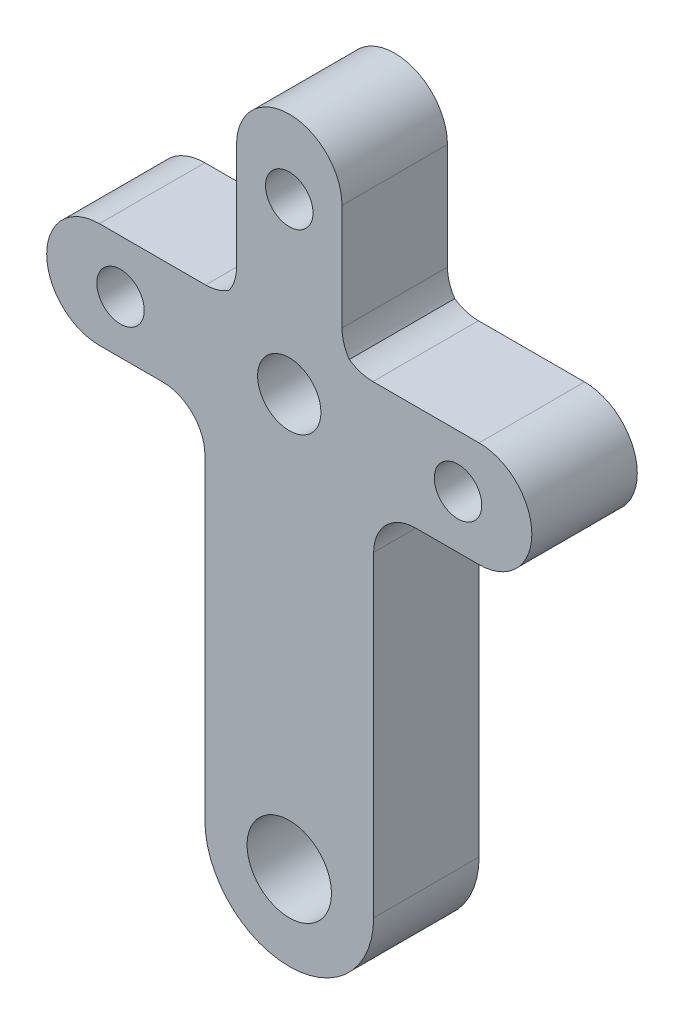
ISO-10303-21;
HEADER;
FILE_DESCRIPTION(('STEP AP214'),'2;1');
FILE_NAME('part.step','',(''),(''),'','','');
FILE_SCHEMA(('AUTOMOTIVE_DESIGN { 1 0 10303 214 1 1 1 1 }'));
ENDSEC;
DATA;
#1=APPLICATION_CONTEXT('core data for automotive mechanical design processes');
#2=APPLICATION_PROTOCOL_DEFINITION('international standard','automotive_design',2000,#1);
#3=PRODUCT_CONTEXT('',#1,'mechanical');
#4=PRODUCT('Part','Part','',(#3));
#5=PRODUCT_RELATED_PRODUCT_CATEGORY('part','',(#4));
#6=PRODUCT_DEFINITION_FORMATION('','',#4);
#7=PRODUCT_DEFINITION_CONTEXT('part definition',#1,'design');
#8=PRODUCT_DEFINITION('design','',#6,#7);
#9=PRODUCT_DEFINITION_SHAPE('','',#8);
#10=(LENGTH_UNIT() NAMED_UNIT(*) SI_UNIT(.MILLI.,.METRE.));
#11=(NAMED_UNIT(*) PLANE_ANGLE_UNIT() SI_UNIT($,.RADIAN.));
#12=(NAMED_UNIT(*) SI_UNIT($,.STERADIAN.) SOLID_ANGLE_UNIT());
#13=UNCERTAINTY_MEASURE_WITH_UNIT(LENGTH_MEASURE(1.E-05),#10,'distance_accuracy_value','');
#14=(GEOMETRIC_REPRESENTATION_CONTEXT(3) GLOBAL_UNCERTAINTY_ASSIGNED_CONTEXT((#13)) GLOBAL_UNIT_ASSIGNED_CONTEXT((#10,
#11,#12)) REPRESENTATION_CONTEXT('',''));
#15=CARTESIAN_POINT('',(0.,0.,0.));
#16=DIRECTION('',(0.,0.,1.));
#17=DIRECTION('',(1.,0.,0.));
#18=AXIS2_PLACEMENT_3D('',#15,#16,#17);
#19=CARTESIAN_POINT('',(0.,0.,5.));
#20=DIRECTION('',(0.,0.,1.));
#21=DIRECTION('',(1.,0.,0.));
#22=AXIS2_PLACEMENT_3D('',#19,#20,#21);
#23=PLANE('',#22);
#24=CARTESIAN_POINT('',(-8.,0.,5.));
#25=DIRECTION('',(0.,0.,1.));
#26=DIRECTION('',(1.,0.,0.));
#27=AXIS2_PLACEMENT_3D('',#24,#25,#26);
#28=CIRCLE('',#27,1.125);
#29=CARTESIAN_POINT('',(-6.875,0.,5.));
#30=VERTEX_POINT('',#29);
#31=EDGE_CURVE('E284',#30,#30,#28,.T.);
#32=ORIENTED_EDGE('',*,*,#31,.F.);
#33=EDGE_LOOP('',(#32));
#34=FACE_BOUND('',#33,.T.);
#35=CARTESIAN_POINT('',(-2.20880571485205E-13,7.99999999999978,5.));
#36=DIRECTION('',(0.,0.,1.));
#37=DIRECTION('',(1.,0.,0.));
#38=AXIS2_PLACEMENT_3D('',#35,#36,#37);
#39=CIRCLE('',#38,1.125);
#40=CARTESIAN_POINT('',(1.12499999999978,7.99999999999978,5.));
#41=VERTEX_POINT('',#40);
#42=EDGE_CURVE('E491',#41,#41,#39,.T.);
#43=ORIENTED_EDGE('',*,*,#42,.F.);
#44=EDGE_LOOP('',(#43));
#45=FACE_BOUND('',#44,.T.);
#46=CARTESIAN_POINT('',(8.,0.,5.));
#47=DIRECTION('',(0.,0.,1.));
#48=DIRECTION('',(1.,0.,0.));
#49=AXIS2_PLACEMENT_3D('',#46,#47,#48);
#50=CIRCLE('',#49,1.125);
#51=CARTESIAN_POINT('',(9.125,0.,5.));
#52=VERTEX_POINT('',#51);
#53=EDGE_CURVE('E475',#52,#52,#50,.T.);
#54=ORIENTED_EDGE('',*,*,#53,.F.);
#55=EDGE_LOOP('',(#54));
#56=FACE_BOUND('',#55,.T.);
#57=CARTESIAN_POINT('',(0.,-19.5,5.));
#58=DIRECTION('',(0.,0.,1.));
#59=DIRECTION('',(1.,0.,0.));
#60=AXIS2_PLACEMENT_3D('',#57,#58,#59);
#61=CIRCLE('',#60,2.);
#62=CARTESIAN_POINT('',(2.,-19.5,5.));
#63=VERTEX_POINT('',#62);
#64=EDGE_CURVE('E277',#63,#63,#61,.T.);
#65=ORIENTED_EDGE('',*,*,#64,.F.);
#66=EDGE_LOOP('',(#65));
#67=FACE_BOUND('',#66,.T.);
#68=CARTESIAN_POINT('',(0.,0.,5.));
#69=DIRECTION('',(0.,0.,1.));
#70=DIRECTION('',(1.,0.,0.));
#71=AXIS2_PLACEMENT_3D('',#68,#69,#70);
#72=CIRCLE('',#71,1.5);
#73=CARTESIAN_POINT('',(1.5,0.,5.));
#74=VERTEX_POINT('',#73);
#75=EDGE_CURVE('E227',#74,#74,#72,.T.);
#76=ORIENTED_EDGE('',*,*,#75,.F.);
#77=EDGE_LOOP('',(#76));
#78=FACE_BOUND('',#77,.T.);
#79=CARTESIAN_POINT('',(3.96862696659689,4.5,5.));
#80=DIRECTION('',(0.,0.,1.));
#81=DIRECTION('',(1.,0.,0.));
#82=AXIS2_PLACEMENT_3D('',#79,#80,#81);
#83=CIRCLE('',#82,2.);
#84=CARTESIAN_POINT('',(3.96862696659689,2.5,5.));
#85=VERTEX_POINT('',#84);
#86=CARTESIAN_POINT('',(2.84528120331248,2.84528120331248,5.));
#87=VERTEX_POINT('',#86);
#88=EDGE_CURVE('E69',#85,#87,#83,.F.);
#89=ORIENTED_EDGE('',*,*,#88,.T.);
#90=CARTESIAN_POINT('',(4.5,3.96862696659689,5.));
#91=DIRECTION('',(0.,0.,1.));
#92=DIRECTION('',(1.,0.,0.));
#93=AXIS2_PLACEMENT_3D('',#90,#91,#92);
#94=CIRCLE('',#93,2.);
#95=CARTESIAN_POINT('',(2.5,3.96862696659689,5.));
#96=VERTEX_POINT('',#95);
#97=EDGE_CURVE('E270',#87,#96,#94,.F.);
#98=ORIENTED_EDGE('',*,*,#97,.T.);
#99=DIRECTION('',(0.,1.,0.));
#100=VECTOR('',#99,1.);
#101=CARTESIAN_POINT('',(2.5,0.,5.));
#102=LINE('',#101,#100);
#103=CARTESIAN_POINT('',(2.5,9.,5.));
#104=VERTEX_POINT('',#103);
#105=EDGE_CURVE('E230',#96,#104,#102,.T.);
#106=ORIENTED_EDGE('',*,*,#105,.T.);
#107=CARTESIAN_POINT('',(0.,9.,5.));
#108=DIRECTION('',(0.,0.,1.));
#109=DIRECTION('',(1.,0.,0.));
#110=AXIS2_PLACEMENT_3D('',#107,#108,#109);
#111=CIRCLE('',#110,2.5);
#112=CARTESIAN_POINT('',(-2.5,9.,5.));
#113=VERTEX_POINT('',#112);
#114=EDGE_CURVE('E359',#104,#113,#111,.T.);
#115=ORIENTED_EDGE('',*,*,#114,.T.);
#116=DIRECTION('',(0.,1.,0.));
#117=VECTOR('',#116,1.);
#118=CARTESIAN_POINT('',(-2.5,0.,5.));
#119=LINE('',#118,#117);
#120=CARTESIAN_POINT('',(-2.5,3.96862696659689,5.));
#121=VERTEX_POINT('',#120);
#122=EDGE_CURVE('E363',#121,#113,#119,.T.);
#123=ORIENTED_EDGE('',*,*,#122,.F.);
#124=CARTESIAN_POINT('',(-4.5,3.96862696659689,5.));
#125=DIRECTION('',(0.,0.,1.));
#126=DIRECTION('',(1.,0.,0.));
#127=AXIS2_PLACEMENT_3D('',#124,#125,#126);
#128=CIRCLE('',#127,2.);
#129=CARTESIAN_POINT('',(-2.84528120331248,2.84528120331248,5.));
#130=VERTEX_POINT('',#129);
#131=EDGE_CURVE('E263',#121,#130,#128,.F.);
#132=ORIENTED_EDGE('',*,*,#131,.T.);
#133=CARTESIAN_POINT('',(-3.96862696659689,4.5,5.));
#134=DIRECTION('',(0.,0.,1.));
#135=DIRECTION('',(1.,0.,0.));
#136=AXIS2_PLACEMENT_3D('',#133,#134,#135);
#137=CIRCLE('',#136,2.);
#138=CARTESIAN_POINT('',(-3.96862696659689,2.5,5.));
#139=VERTEX_POINT('',#138);
#140=EDGE_CURVE('E259',#130,#139,#137,.F.);
#141=ORIENTED_EDGE('',*,*,#140,.T.);
#142=DIRECTION('',(-1.,0.,0.));
#143=VECTOR('',#142,1.);
#144=CARTESIAN_POINT('',(0.,2.5,5.));
#145=LINE('',#144,#143);
#146=CARTESIAN_POINT('',(-9.,2.5,5.));
#147=VERTEX_POINT('',#146);
#148=EDGE_CURVE('E181',#139,#147,#145,.T.);
#149=ORIENTED_EDGE('',*,*,#148,.T.);
#150=CARTESIAN_POINT('',(-9.,0.,5.));
#151=DIRECTION('',(0.,0.,1.));
#152=DIRECTION('',(1.,0.,0.));
#153=AXIS2_PLACEMENT_3D('',#150,#151,#152);
#154=CIRCLE('',#153,2.5);
#155=CARTESIAN_POINT('',(-9.,-2.5,5.));
#156=VERTEX_POINT('',#155);
#157=EDGE_CURVE('E190',#147,#156,#154,.T.);
#158=ORIENTED_EDGE('',*,*,#157,.T.);
#159=DIRECTION('',(-1.,0.,0.));
#160=VECTOR('',#159,1.);
#161=CARTESIAN_POINT('',(0.,-2.5,5.));
#162=LINE('',#161,#160);
#163=CARTESIAN_POINT('',(-6.,-2.5,5.));
#164=VERTEX_POINT('',#163);
#165=EDGE_CURVE('E368',#164,#156,#162,.T.);
#166=ORIENTED_EDGE('',*,*,#165,.F.);
#167=CARTESIAN_POINT('',(-6.,-4.5,5.));
#168=DIRECTION('',(0.,0.,1.));
#169=DIRECTION('',(1.,0.,0.));
#170=AXIS2_PLACEMENT_3D('',#167,#168,#169);
#171=CIRCLE('',#170,2.);
#172=CARTESIAN_POINT('',(-4.,-4.5,5.));
#173=VERTEX_POINT('',#172);
#174=EDGE_CURVE('E255',#164,#173,#171,.F.);
#175=ORIENTED_EDGE('',*,*,#174,.T.);
#176=DIRECTION('',(0.,-1.,0.));
#177=VECTOR('',#176,1.);
#178=CARTESIAN_POINT('',(-4.,0.,5.));
#179=LINE('',#178,#177);
#180=CARTESIAN_POINT('',(-4.,-19.5,5.));
#181=VERTEX_POINT('',#180);
#182=EDGE_CURVE('E207',#173,#181,#179,.T.);
#183=ORIENTED_EDGE('',*,*,#182,.T.);
#184=CARTESIAN_POINT('',(0.,-19.5,5.));
#185=DIRECTION('',(0.,0.,1.));
#186=DIRECTION('',(1.,0.,0.));
#187=AXIS2_PLACEMENT_3D('',#184,#185,#186);
#188=CIRCLE('',#187,4.);
#189=CARTESIAN_POINT('',(4.,-19.5,5.));
#190=VERTEX_POINT('',#189);
#191=EDGE_CURVE('E379',#181,#190,#188,.T.);
#192=ORIENTED_EDGE('',*,*,#191,.T.);
#193=DIRECTION('',(0.,-1.,0.));
#194=VECTOR('',#193,1.);
#195=CARTESIAN_POINT('',(4.,0.,5.));
#196=LINE('',#195,#194);
#197=CARTESIAN_POINT('',(4.,-4.5,5.));
#198=VERTEX_POINT('',#197);
#199=EDGE_CURVE('E372',#198,#190,#196,.T.);
#200=ORIENTED_EDGE('',*,*,#199,.F.);
#201=CARTESIAN_POINT('',(6.,-4.5,5.));
#202=DIRECTION('',(0.,0.,1.));
#203=DIRECTION('',(1.,0.,0.));
#204=AXIS2_PLACEMENT_3D('',#201,#202,#203);
#205=CIRCLE('',#204,2.);
#206=CARTESIAN_POINT('',(6.,-2.5,5.));
#207=VERTEX_POINT('',#206);
#208=EDGE_CURVE('E53',#198,#207,#205,.F.);
#209=ORIENTED_EDGE('',*,*,#208,.T.);
#210=DIRECTION('',(1.,0.,0.));
#211=VECTOR('',#210,1.);
#212=CARTESIAN_POINT('',(0.,-2.5,5.));
#213=LINE('',#212,#211);
#214=CARTESIAN_POINT('',(9.,-2.5,5.));
#215=VERTEX_POINT('',#214);
#216=EDGE_CURVE('E219',#207,#215,#213,.T.);
#217=ORIENTED_EDGE('',*,*,#216,.T.);
#218=CARTESIAN_POINT('',(9.,0.,5.));
#219=DIRECTION('',(0.,0.,1.));
#220=DIRECTION('',(1.,0.,0.));
#221=AXIS2_PLACEMENT_3D('',#218,#219,#220);
#222=CIRCLE('',#221,2.5);
#223=CARTESIAN_POINT('',(9.,2.5,5.));
#224=VERTEX_POINT('',#223);
#225=EDGE_CURVE('E350',#215,#224,#222,.T.);
#226=ORIENTED_EDGE('',*,*,#225,.T.);
#227=DIRECTION('',(1.,0.,0.));
#228=VECTOR('',#227,1.);
#229=CARTESIAN_POINT('',(0.,2.5,5.));
#230=LINE('',#229,#228);
#231=EDGE_CURVE('E346',#85,#224,#230,.T.);
#232=ORIENTED_EDGE('',*,*,#231,.F.);
#233=EDGE_LOOP('',(#89,#98,#106,#115,#123,#132,#141,#149,#158,#166,#175,#183,#192,#200,#209,
#217,#226,#232));
#234=FACE_BOUND('',#233,.T.);
#235=ADVANCED_FACE('F44',(#34,#45,#56,#67,#78,#234),#23,.T.);
#236=CARTESIAN_POINT('',(0.,0.,0.));
#237=DIRECTION('',(0.,0.,1.));
#238=DIRECTION('',(1.,0.,0.));
#239=AXIS2_PLACEMENT_3D('',#236,#237,#238);
#240=PLANE('',#239);
#241=CARTESIAN_POINT('',(-8.,0.,0.));
#242=DIRECTION('',(0.,0.,1.));
#243=DIRECTION('',(1.,0.,0.));
#244=AXIS2_PLACEMENT_3D('',#241,#242,#243);
#245=CIRCLE('',#244,1.125);
#246=CARTESIAN_POINT('',(-6.875,0.,0.));
#247=VERTEX_POINT('',#246);
#248=EDGE_CURVE('E48',#247,#247,#245,.T.);
#249=ORIENTED_EDGE('',*,*,#248,.T.);
#250=EDGE_LOOP('',(#249));
#251=FACE_BOUND('',#250,.T.);
#252=CARTESIAN_POINT('',(-2.20880571485205E-13,7.99999999999978,0.));
#253=DIRECTION('',(0.,0.,1.));
#254=DIRECTION('',(1.,0.,0.));
#255=AXIS2_PLACEMENT_3D('',#252,#253,#254);
#256=CIRCLE('',#255,1.125);
#257=CARTESIAN_POINT('',(1.12499999999978,7.99999999999978,0.));
#258=VERTEX_POINT('',#257);
#259=EDGE_CURVE('E283',#258,#258,#256,.T.);
#260=ORIENTED_EDGE('',*,*,#259,.T.);
#261=EDGE_LOOP('',(#260));
#262=FACE_BOUND('',#261,.T.);
#263=CARTESIAN_POINT('',(8.,0.,0.));
#264=DIRECTION('',(0.,0.,1.));
#265=DIRECTION('',(1.,0.,0.));
#266=AXIS2_PLACEMENT_3D('',#263,#264,#265);
#267=CIRCLE('',#266,1.125);
#268=CARTESIAN_POINT('',(9.125,0.,0.));
#269=VERTEX_POINT('',#268);
#270=EDGE_CURVE('E281',#269,#269,#267,.T.);
#271=ORIENTED_EDGE('',*,*,#270,.T.);
#272=EDGE_LOOP('',(#271));
#273=FACE_BOUND('',#272,.T.);
#274=CARTESIAN_POINT('',(0.,-19.5,0.));
#275=DIRECTION('',(0.,0.,1.));
#276=DIRECTION('',(1.,0.,0.));
#277=AXIS2_PLACEMENT_3D('',#274,#275,#276);
#278=CIRCLE('',#277,2.);
#279=CARTESIAN_POINT('',(2.,-19.5,0.));
#280=VERTEX_POINT('',#279);
#281=EDGE_CURVE('E361',#280,#280,#278,.F.);
#282=ORIENTED_EDGE('',*,*,#281,.F.);
#283=EDGE_LOOP('',(#282));
#284=FACE_BOUND('',#283,.T.);
#285=CARTESIAN_POINT('',(0.,0.,0.));
#286=DIRECTION('',(0.,0.,1.));
#287=DIRECTION('',(1.,0.,0.));
#288=AXIS2_PLACEMENT_3D('',#285,#286,#287);
#289=CIRCLE('',#288,1.5);
#290=CARTESIAN_POINT('',(1.5,0.,0.));
#291=VERTEX_POINT('',#290);
#292=EDGE_CURVE('E234',#291,#291,#289,.F.);
#293=ORIENTED_EDGE('',*,*,#292,.F.);
#294=EDGE_LOOP('',(#293));
#295=FACE_BOUND('',#294,.T.);
#296=CARTESIAN_POINT('',(0.,9.,0.));
#297=DIRECTION('',(0.,0.,1.));
#298=DIRECTION('',(1.,0.,0.));
#299=AXIS2_PLACEMENT_3D('',#296,#297,#298);
#300=CIRCLE('',#299,2.5);
#301=CARTESIAN_POINT('',(-2.5,9.,0.));
#302=VERTEX_POINT('',#301);
#303=CARTESIAN_POINT('',(2.5,9.,0.));
#304=VERTEX_POINT('',#303);
#305=EDGE_CURVE('E360',#302,#304,#300,.F.);
#306=ORIENTED_EDGE('',*,*,#305,.T.);
#307=DIRECTION('',(0.,-1.,0.));
#308=VECTOR('',#307,1.);
#309=CARTESIAN_POINT('',(2.5,0.,0.));
#310=LINE('',#309,#308);
#311=CARTESIAN_POINT('',(2.5,3.96862696659689,0.));
#312=VERTEX_POINT('',#311);
#313=EDGE_CURVE('E228',#304,#312,#310,.T.);
#314=ORIENTED_EDGE('',*,*,#313,.T.);
#315=CARTESIAN_POINT('',(4.5,3.96862696659689,0.));
#316=DIRECTION('',(0.,0.,1.));
#317=DIRECTION('',(1.,0.,0.));
#318=AXIS2_PLACEMENT_3D('',#315,#316,#317);
#319=CIRCLE('',#318,2.);
#320=CARTESIAN_POINT('',(2.84528120331248,2.84528120331248,0.));
#321=VERTEX_POINT('',#320);
#322=EDGE_CURVE('E61',#312,#321,#319,.T.);
#323=ORIENTED_EDGE('',*,*,#322,.T.);
#324=CARTESIAN_POINT('',(3.96862696659689,4.5,0.));
#325=DIRECTION('',(0.,0.,1.));
#326=DIRECTION('',(1.,0.,0.));
#327=AXIS2_PLACEMENT_3D('',#324,#325,#326);
#328=CIRCLE('',#327,2.);
#329=CARTESIAN_POINT('',(3.96862696659689,2.5,0.));
#330=VERTEX_POINT('',#329);
#331=EDGE_CURVE('E268',#321,#330,#328,.T.);
#332=ORIENTED_EDGE('',*,*,#331,.T.);
#333=DIRECTION('',(-1.,0.,0.));
#334=VECTOR('',#333,1.);
#335=CARTESIAN_POINT('',(0.,2.5,0.));
#336=LINE('',#335,#334);
#337=CARTESIAN_POINT('',(9.,2.5,0.));
#338=VERTEX_POINT('',#337);
#339=EDGE_CURVE('E215',#338,#330,#336,.T.);
#340=ORIENTED_EDGE('',*,*,#339,.F.);
#341=CARTESIAN_POINT('',(9.,0.,0.));
#342=DIRECTION('',(0.,0.,1.));
#343=DIRECTION('',(1.,0.,0.));
#344=AXIS2_PLACEMENT_3D('',#341,#342,#343);
#345=CIRCLE('',#344,2.5);
#346=CARTESIAN_POINT('',(9.,-2.5,0.));
#347=VERTEX_POINT('',#346);
#348=EDGE_CURVE('E221',#338,#347,#345,.F.);
#349=ORIENTED_EDGE('',*,*,#348,.T.);
#350=DIRECTION('',(-1.,0.,0.));
#351=VECTOR('',#350,1.);
#352=CARTESIAN_POINT('',(0.,-2.5,0.));
#353=LINE('',#352,#351);
#354=CARTESIAN_POINT('',(6.,-2.5,0.));
#355=VERTEX_POINT('',#354);
#356=EDGE_CURVE('E216',#347,#355,#353,.T.);
#357=ORIENTED_EDGE('',*,*,#356,.T.);
#358=CARTESIAN_POINT('',(6.,-4.5,0.));
#359=DIRECTION('',(0.,0.,1.));
#360=DIRECTION('',(1.,0.,0.));
#361=AXIS2_PLACEMENT_3D('',#358,#359,#360);
#362=CIRCLE('',#361,2.);
#363=CARTESIAN_POINT('',(4.,-4.5,0.));
#364=VERTEX_POINT('',#363);
#365=EDGE_CURVE('E12',#355,#364,#362,.T.);
#366=ORIENTED_EDGE('',*,*,#365,.T.);
#367=DIRECTION('',(0.,1.,0.));
#368=VECTOR('',#367,1.);
#369=CARTESIAN_POINT('',(4.,0.,0.));
#370=LINE('',#369,#368);
#371=CARTESIAN_POINT('',(4.,-19.5,0.));
#372=VERTEX_POINT('',#371);
#373=EDGE_CURVE('E202',#372,#364,#370,.T.);
#374=ORIENTED_EDGE('',*,*,#373,.F.);
#375=CARTESIAN_POINT('',(0.,-19.5,0.));
#376=DIRECTION('',(0.,0.,1.));
#377=DIRECTION('',(1.,0.,0.));
#378=AXIS2_PLACEMENT_3D('',#375,#376,#377);
#379=CIRCLE('',#378,4.);
#380=CARTESIAN_POINT('',(-4.,-19.5,0.));
#381=VERTEX_POINT('',#380);
#382=EDGE_CURVE('E209',#372,#381,#379,.F.);
#383=ORIENTED_EDGE('',*,*,#382,.T.);
#384=DIRECTION('',(0.,1.,0.));
#385=VECTOR('',#384,1.);
#386=CARTESIAN_POINT('',(-4.,0.,0.));
#387=LINE('',#386,#385);
#388=CARTESIAN_POINT('',(-4.,-4.5,0.));
#389=VERTEX_POINT('',#388);
#390=EDGE_CURVE('E204',#381,#389,#387,.T.);
#391=ORIENTED_EDGE('',*,*,#390,.T.);
#392=CARTESIAN_POINT('',(-6.,-4.5,0.));
#393=DIRECTION('',(0.,0.,1.));
#394=DIRECTION('',(1.,0.,0.));
#395=AXIS2_PLACEMENT_3D('',#392,#393,#394);
#396=CIRCLE('',#395,2.);
#397=CARTESIAN_POINT('',(-6.,-2.5,0.));
#398=VERTEX_POINT('',#397);
#399=EDGE_CURVE('E257',#389,#398,#396,.T.);
#400=ORIENTED_EDGE('',*,*,#399,.T.);
#401=DIRECTION('',(1.,0.,0.));
#402=VECTOR('',#401,1.);
#403=CARTESIAN_POINT('',(0.,-2.5,0.));
#404=LINE('',#403,#402);
#405=CARTESIAN_POINT('',(-9.,-2.5,0.));
#406=VERTEX_POINT('',#405);
#407=EDGE_CURVE('E196',#406,#398,#404,.T.);
#408=ORIENTED_EDGE('',*,*,#407,.F.);
#409=CARTESIAN_POINT('',(-9.,0.,0.));
#410=DIRECTION('',(0.,0.,1.));
#411=DIRECTION('',(1.,0.,0.));
#412=AXIS2_PLACEMENT_3D('',#409,#410,#411);
#413=CIRCLE('',#412,2.5);
#414=CARTESIAN_POINT('',(-9.,2.5,0.));
#415=VERTEX_POINT('',#414);
#416=EDGE_CURVE('E187',#406,#415,#413,.F.);
#417=ORIENTED_EDGE('',*,*,#416,.T.);
#418=DIRECTION('',(1.,0.,0.));
#419=VECTOR('',#418,1.);
#420=CARTESIAN_POINT('',(0.,2.5,0.));
#421=LINE('',#420,#419);
#422=CARTESIAN_POINT('',(-3.96862696659689,2.5,0.));
#423=VERTEX_POINT('',#422);
#424=EDGE_CURVE('E172',#415,#423,#421,.T.);
#425=ORIENTED_EDGE('',*,*,#424,.T.);
#426=CARTESIAN_POINT('',(-3.96862696659689,4.5,0.));
#427=DIRECTION('',(0.,0.,1.));
#428=DIRECTION('',(1.,0.,0.));
#429=AXIS2_PLACEMENT_3D('',#426,#427,#428);
#430=CIRCLE('',#429,2.);
#431=CARTESIAN_POINT('',(-2.84528120331248,2.84528120331248,0.));
#432=VERTEX_POINT('',#431);
#433=EDGE_CURVE('E261',#423,#432,#430,.T.);
#434=ORIENTED_EDGE('',*,*,#433,.T.);
#435=CARTESIAN_POINT('',(-4.5,3.96862696659689,0.));
#436=DIRECTION('',(0.,0.,1.));
#437=DIRECTION('',(1.,0.,0.));
#438=AXIS2_PLACEMENT_3D('',#435,#436,#437);
#439=CIRCLE('',#438,2.);
#440=CARTESIAN_POINT('',(-2.5,3.96862696659689,0.));
#441=VERTEX_POINT('',#440);
#442=EDGE_CURVE('E265',#432,#441,#439,.T.);
#443=ORIENTED_EDGE('',*,*,#442,.T.);
#444=DIRECTION('',(0.,-1.,0.));
#445=VECTOR('',#444,1.);
#446=CARTESIAN_POINT('',(-2.5,0.,0.));
#447=LINE('',#446,#445);
#448=EDGE_CURVE('E203',#302,#441,#447,.T.);
#449=ORIENTED_EDGE('',*,*,#448,.F.);
#450=EDGE_LOOP('',(#306,#314,#323,#332,#340,#349,#357,#366,#374,#383,#391,#400,#408,#417,#425,
#434,#443,#449));
#451=FACE_BOUND('',#450,.T.);
#452=ADVANCED_FACE('F194',(#251,#262,#273,#284,#295,#451),#240,.F.);
#453=CARTESIAN_POINT('',(0.,0.,-4.24264068711928));
#454=DIRECTION('',(0.,0.,1.));
#455=DIRECTION('',(1.,0.,0.));
#456=AXIS2_PLACEMENT_3D('',#453,#454,#455);
#457=CYLINDRICAL_SURFACE('',#456,1.5);
#458=ORIENTED_EDGE('',*,*,#292,.T.);
#459=EDGE_LOOP('',(#458));
#460=FACE_BOUND('',#459,.T.);
#461=ORIENTED_EDGE('',*,*,#75,.T.);
#462=EDGE_LOOP('',(#461));
#463=FACE_BOUND('',#462,.T.);
#464=ADVANCED_FACE('F310',(#460,#463),#457,.F.);
#465=CARTESIAN_POINT('',(0.,9.,-74.2462120245875));
#466=DIRECTION('',(0.,0.,1.));
#467=DIRECTION('',(1.,0.,0.));
#468=AXIS2_PLACEMENT_3D('',#465,#466,#467);
#469=CYLINDRICAL_SURFACE('',#468,2.5);
#470=DIRECTION('',(0.,0.,1.));
#471=VECTOR('',#470,1.);
#472=CARTESIAN_POINT('',(-2.5,9.,-74.2462120245875));
#473=LINE('',#472,#471);
#474=EDGE_CURVE('E182',#302,#113,#473,.T.);
#475=ORIENTED_EDGE('',*,*,#474,.T.);
#476=ORIENTED_EDGE('',*,*,#114,.F.);
#477=DIRECTION('',(0.,0.,1.));
#478=VECTOR('',#477,1.);
#479=CARTESIAN_POINT('',(2.5,9.,-74.2462120245875));
#480=LINE('',#479,#478);
#481=EDGE_CURVE('E356',#304,#104,#480,.T.);
#482=ORIENTED_EDGE('',*,*,#481,.F.);
#483=ORIENTED_EDGE('',*,*,#305,.F.);
#484=EDGE_LOOP('',(#475,#476,#482,#483));
#485=FACE_BOUND('',#484,.T.);
#486=ADVANCED_FACE('F444',(#485),#469,.T.);
#487=CARTESIAN_POINT('',(-2.5,0.,-74.2462120245875));
#488=DIRECTION('',(1.,0.,0.));
#489=DIRECTION('',(0.,1.,0.));
#490=AXIS2_PLACEMENT_3D('',#487,#488,#489);
#491=PLANE('',#490);
#492=ORIENTED_EDGE('',*,*,#448,.T.);
#493=DIRECTION('',(0.,0.,1.));
#494=VECTOR('',#493,1.);
#495=CARTESIAN_POINT('',(-2.5,3.96862696659689,-74.2462120245875));
#496=LINE('',#495,#494);
#497=EDGE_CURVE('E243',#441,#121,#496,.T.);
#498=ORIENTED_EDGE('',*,*,#497,.T.);
#499=ORIENTED_EDGE('',*,*,#122,.T.);
#500=ORIENTED_EDGE('',*,*,#474,.F.);
#501=EDGE_LOOP('',(#492,#498,#499,#500));
#502=FACE_BOUND('',#501,.T.);
#503=ADVANCED_FACE('F442',(#502),#491,.F.);
#504=CARTESIAN_POINT('',(0.,2.5,-74.2462120245875));
#505=DIRECTION('',(0.,1.,0.));
#506=DIRECTION('',(-1.,0.,0.));
#507=AXIS2_PLACEMENT_3D('',#504,#505,#506);
#508=PLANE('',#507);
#509=ORIENTED_EDGE('',*,*,#148,.F.);
#510=DIRECTION('',(0.,0.,-1.));
#511=VECTOR('',#510,1.);
#512=CARTESIAN_POINT('',(-3.96862696659689,2.5,0.));
#513=LINE('',#512,#511);
#514=EDGE_CURVE('E179',#139,#423,#513,.T.);
#515=ORIENTED_EDGE('',*,*,#514,.T.);
#516=ORIENTED_EDGE('',*,*,#424,.F.);
#517=DIRECTION('',(0.,0.,1.));
#518=VECTOR('',#517,1.);
#519=CARTESIAN_POINT('',(-9.,2.5,-74.2462120245875));
#520=LINE('',#519,#518);
#521=EDGE_CURVE('E176',#415,#147,#520,.T.);
#522=ORIENTED_EDGE('',*,*,#521,.T.);
#523=EDGE_LOOP('',(#509,#515,#516,#522));
#524=FACE_BOUND('',#523,.T.);
#525=ADVANCED_FACE('F175',(#524),#508,.T.);
#526=CARTESIAN_POINT('',(-9.,0.,-74.2462120245875));
#527=DIRECTION('',(0.,0.,1.));
#528=DIRECTION('',(1.,0.,0.));
#529=AXIS2_PLACEMENT_3D('',#526,#527,#528);
#530=CYLINDRICAL_SURFACE('',#529,2.5);
#531=DIRECTION('',(0.,0.,1.));
#532=VECTOR('',#531,1.);
#533=CARTESIAN_POINT('',(-9.,-2.5,-74.2462120245875));
#534=LINE('',#533,#532);
#535=EDGE_CURVE('E208',#406,#156,#534,.T.);
#536=ORIENTED_EDGE('',*,*,#535,.T.);
#537=ORIENTED_EDGE('',*,*,#157,.F.);
#538=ORIENTED_EDGE('',*,*,#521,.F.);
#539=ORIENTED_EDGE('',*,*,#416,.F.);
#540=EDGE_LOOP('',(#536,#537,#538,#539));
#541=FACE_BOUND('',#540,.T.);
#542=ADVANCED_FACE('F186',(#541),#530,.T.);
#543=CARTESIAN_POINT('',(0.,-2.5,-74.2462120245875));
#544=DIRECTION('',(0.,1.,0.));
#545=DIRECTION('',(-1.,0.,0.));
#546=AXIS2_PLACEMENT_3D('',#543,#544,#545);
#547=PLANE('',#546);
#548=ORIENTED_EDGE('',*,*,#407,.T.);
#549=DIRECTION('',(0.,0.,1.));
#550=VECTOR('',#549,1.);
#551=CARTESIAN_POINT('',(-6.,-2.5,-74.2462120245875));
#552=LINE('',#551,#550);
#553=EDGE_CURVE('E237',#398,#164,#552,.T.);
#554=ORIENTED_EDGE('',*,*,#553,.T.);
#555=ORIENTED_EDGE('',*,*,#165,.T.);
#556=ORIENTED_EDGE('',*,*,#535,.F.);
#557=EDGE_LOOP('',(#548,#554,#555,#556));
#558=FACE_BOUND('',#557,.T.);
#559=ADVANCED_FACE('F434',(#558),#547,.F.);
#560=CARTESIAN_POINT('',(-4.,0.,-74.2462120245875));
#561=DIRECTION('',(-1.,0.,0.));
#562=DIRECTION('',(0.,-1.,0.));
#563=AXIS2_PLACEMENT_3D('',#560,#561,#562);
#564=PLANE('',#563);
#565=ORIENTED_EDGE('',*,*,#182,.F.);
#566=DIRECTION('',(0.,0.,1.));
#567=VECTOR('',#566,1.);
#568=CARTESIAN_POINT('',(-4.,-4.5,-74.2462120245875));
#569=LINE('',#568,#567);
#570=EDGE_CURVE('E240',#173,#389,#569,.F.);
#571=ORIENTED_EDGE('',*,*,#570,.T.);
#572=ORIENTED_EDGE('',*,*,#390,.F.);
#573=DIRECTION('',(0.,0.,1.));
#574=VECTOR('',#573,1.);
#575=CARTESIAN_POINT('',(-4.,-19.5,-74.2462120245875));
#576=LINE('',#575,#574);
#577=EDGE_CURVE('E212',#381,#181,#576,.T.);
#578=ORIENTED_EDGE('',*,*,#577,.T.);
#579=EDGE_LOOP('',(#565,#571,#572,#578));
#580=FACE_BOUND('',#579,.T.);
#581=ADVANCED_FACE('F404',(#580),#564,.T.);
#582=CARTESIAN_POINT('',(0.,-19.5,-74.2462120245875));
#583=DIRECTION('',(0.,0.,1.));
#584=DIRECTION('',(1.,0.,0.));
#585=AXIS2_PLACEMENT_3D('',#582,#583,#584);
#586=CYLINDRICAL_SURFACE('',#585,4.);
#587=DIRECTION('',(0.,0.,1.));
#588=VECTOR('',#587,1.);
#589=CARTESIAN_POINT('',(4.,-19.5,-74.2462120245875));
#590=LINE('',#589,#588);
#591=EDGE_CURVE('E220',#372,#190,#590,.T.);
#592=ORIENTED_EDGE('',*,*,#591,.T.);
#593=ORIENTED_EDGE('',*,*,#191,.F.);
#594=ORIENTED_EDGE('',*,*,#577,.F.);
#595=ORIENTED_EDGE('',*,*,#382,.F.);
#596=EDGE_LOOP('',(#592,#593,#594,#595));
#597=FACE_BOUND('',#596,.T.);
#598=ADVANCED_FACE('F395',(#597),#586,.T.);
#599=CARTESIAN_POINT('',(4.,0.,-74.2462120245875));
#600=DIRECTION('',(-1.,0.,0.));
#601=DIRECTION('',(0.,-1.,0.));
#602=AXIS2_PLACEMENT_3D('',#599,#600,#601);
#603=PLANE('',#602);
#604=ORIENTED_EDGE('',*,*,#373,.T.);
#605=DIRECTION('',(0.,0.,1.));
#606=VECTOR('',#605,1.);
#607=CARTESIAN_POINT('',(4.,-4.5,-74.2462120245875));
#608=LINE('',#607,#606);
#609=EDGE_CURVE('E250',#364,#198,#608,.T.);
#610=ORIENTED_EDGE('',*,*,#609,.T.);
#611=ORIENTED_EDGE('',*,*,#199,.T.);
#612=ORIENTED_EDGE('',*,*,#591,.F.);
#613=EDGE_LOOP('',(#604,#610,#611,#612));
#614=FACE_BOUND('',#613,.T.);
#615=ADVANCED_FACE('F408',(#614),#603,.F.);
#616=CARTESIAN_POINT('',(0.,-2.5,-74.2462120245875));
#617=DIRECTION('',(0.,-1.,0.));
#618=DIRECTION('',(0.,0.,-1.));
#619=AXIS2_PLACEMENT_3D('',#616,#617,#618);
#620=PLANE('',#619);
#621=ORIENTED_EDGE('',*,*,#216,.F.);
#622=DIRECTION('',(0.,0.,1.));
#623=VECTOR('',#622,1.);
#624=CARTESIAN_POINT('',(6.,-2.5,-74.2462120245875));
#625=LINE('',#624,#623);
#626=EDGE_CURVE('E253',#207,#355,#625,.F.);
#627=ORIENTED_EDGE('',*,*,#626,.T.);
#628=ORIENTED_EDGE('',*,*,#356,.F.);
#629=DIRECTION('',(0.,0.,1.));
#630=VECTOR('',#629,1.);
#631=CARTESIAN_POINT('',(9.,-2.5,-74.2462120245875));
#632=LINE('',#631,#630);
#633=EDGE_CURVE('E224',#347,#215,#632,.T.);
#634=ORIENTED_EDGE('',*,*,#633,.T.);
#635=EDGE_LOOP('',(#621,#627,#628,#634));
#636=FACE_BOUND('',#635,.T.);
#637=ADVANCED_FACE('F414',(#636),#620,.T.);
#638=CARTESIAN_POINT('',(9.,0.,-74.2462120245875));
#639=DIRECTION('',(0.,0.,1.));
#640=DIRECTION('',(1.,0.,0.));
#641=AXIS2_PLACEMENT_3D('',#638,#639,#640);
#642=CYLINDRICAL_SURFACE('',#641,2.5);
#643=DIRECTION('',(0.,0.,1.));
#644=VECTOR('',#643,1.);
#645=CARTESIAN_POINT('',(9.,2.5,-74.2462120245875));
#646=LINE('',#645,#644);
#647=EDGE_CURVE('E231',#338,#224,#646,.T.);
#648=ORIENTED_EDGE('',*,*,#647,.T.);
#649=ORIENTED_EDGE('',*,*,#225,.F.);
#650=ORIENTED_EDGE('',*,*,#633,.F.);
#651=ORIENTED_EDGE('',*,*,#348,.F.);
#652=EDGE_LOOP('',(#648,#649,#650,#651));
#653=FACE_BOUND('',#652,.T.);
#654=ADVANCED_FACE('F416',(#653),#642,.T.);
#655=CARTESIAN_POINT('',(0.,2.5,-74.2462120245875));
#656=DIRECTION('',(0.,-1.,0.));
#657=DIRECTION('',(0.,0.,-1.));
#658=AXIS2_PLACEMENT_3D('',#655,#656,#657);
#659=PLANE('',#658);
#660=ORIENTED_EDGE('',*,*,#339,.T.);
#661=DIRECTION('',(0.,0.,1.));
#662=VECTOR('',#661,1.);
#663=CARTESIAN_POINT('',(3.96862696659689,2.5,-74.2462120245875));
#664=LINE('',#663,#662);
#665=EDGE_CURVE('E245',#330,#85,#664,.T.);
#666=ORIENTED_EDGE('',*,*,#665,.T.);
#667=ORIENTED_EDGE('',*,*,#231,.T.);
#668=ORIENTED_EDGE('',*,*,#647,.F.);
#669=EDGE_LOOP('',(#660,#666,#667,#668));
#670=FACE_BOUND('',#669,.T.);
#671=ADVANCED_FACE('F344',(#670),#659,.F.);
#672=CARTESIAN_POINT('',(2.5,0.,-74.2462120245875));
#673=DIRECTION('',(1.,0.,0.));
#674=DIRECTION('',(0.,1.,0.));
#675=AXIS2_PLACEMENT_3D('',#672,#673,#674);
#676=PLANE('',#675);
#677=ORIENTED_EDGE('',*,*,#105,.F.);
#678=DIRECTION('',(0.,0.,-1.));
#679=VECTOR('',#678,1.);
#680=CARTESIAN_POINT('',(2.5,3.96862696659689,0.));
#681=LINE('',#680,#679);
#682=EDGE_CURVE('E248',#96,#312,#681,.T.);
#683=ORIENTED_EDGE('',*,*,#682,.T.);
#684=ORIENTED_EDGE('',*,*,#313,.F.);
#685=ORIENTED_EDGE('',*,*,#481,.T.);
#686=EDGE_LOOP('',(#677,#683,#684,#685));
#687=FACE_BOUND('',#686,.T.);
#688=ADVANCED_FACE('F423',(#687),#676,.T.);
#689=CARTESIAN_POINT('',(0.,-19.5,-74.2462120245875));
#690=DIRECTION('',(0.,0.,1.));
#691=DIRECTION('',(1.,0.,0.));
#692=AXIS2_PLACEMENT_3D('',#689,#690,#691);
#693=CYLINDRICAL_SURFACE('',#692,2.);
#694=ORIENTED_EDGE('',*,*,#281,.T.);
#695=EDGE_LOOP('',(#694));
#696=FACE_BOUND('',#695,.T.);
#697=ORIENTED_EDGE('',*,*,#64,.T.);
#698=EDGE_LOOP('',(#697));
#699=FACE_BOUND('',#698,.T.);
#700=ADVANCED_FACE('F321',(#696,#699),#693,.F.);
#701=CARTESIAN_POINT('',(-6.,-4.5,-74.2462120245875));
#702=DIRECTION('',(0.,0.,1.));
#703=DIRECTION('',(1.,0.,0.));
#704=AXIS2_PLACEMENT_3D('',#701,#702,#703);
#705=CYLINDRICAL_SURFACE('',#704,2.);
#706=ORIENTED_EDGE('',*,*,#399,.F.);
#707=ORIENTED_EDGE('',*,*,#570,.F.);
#708=ORIENTED_EDGE('',*,*,#174,.F.);
#709=ORIENTED_EDGE('',*,*,#553,.F.);
#710=EDGE_LOOP('',(#706,#707,#708,#709));
#711=FACE_BOUND('',#710,.T.);
#712=ADVANCED_FACE('F317',(#711),#705,.F.);
#713=CARTESIAN_POINT('',(-4.5,3.96862696659689,-74.2462120245875));
#714=DIRECTION('',(0.,0.,1.));
#715=DIRECTION('',(1.,0.,0.));
#716=AXIS2_PLACEMENT_3D('',#713,#714,#715);
#717=CYLINDRICAL_SURFACE('',#716,2.);
#718=ORIENTED_EDGE('',*,*,#497,.F.);
#719=ORIENTED_EDGE('',*,*,#442,.F.);
#720=DIRECTION('',(0.,0.,1.));
#721=VECTOR('',#720,1.);
#722=CARTESIAN_POINT('',(-2.84528120331248,2.84528120331248,2.5));
#723=LINE('',#722,#721);
#724=EDGE_CURVE('E274',#130,#432,#723,.F.);
#725=ORIENTED_EDGE('',*,*,#724,.F.);
#726=ORIENTED_EDGE('',*,*,#131,.F.);
#727=EDGE_LOOP('',(#718,#719,#725,#726));
#728=FACE_BOUND('',#727,.T.);
#729=ADVANCED_FACE('F320',(#728),#717,.F.);
#730=CARTESIAN_POINT('',(-3.96862696659689,4.5,-74.2462120245875));
#731=DIRECTION('',(0.,0.,1.));
#732=DIRECTION('',(1.,0.,0.));
#733=AXIS2_PLACEMENT_3D('',#730,#731,#732);
#734=CYLINDRICAL_SURFACE('',#733,2.);
#735=ORIENTED_EDGE('',*,*,#433,.F.);
#736=ORIENTED_EDGE('',*,*,#514,.F.);
#737=ORIENTED_EDGE('',*,*,#140,.F.);
#738=ORIENTED_EDGE('',*,*,#724,.T.);
#739=EDGE_LOOP('',(#735,#736,#737,#738));
#740=FACE_BOUND('',#739,.T.);
#741=ADVANCED_FACE('F323',(#740),#734,.F.);
#742=CARTESIAN_POINT('',(4.5,3.96862696659689,-74.2462120245875));
#743=DIRECTION('',(0.,0.,1.));
#744=DIRECTION('',(1.,0.,0.));
#745=AXIS2_PLACEMENT_3D('',#742,#743,#744);
#746=CYLINDRICAL_SURFACE('',#745,2.);
#747=DIRECTION('',(0.,0.,1.));
#748=VECTOR('',#747,1.);
#749=CARTESIAN_POINT('',(2.84528120331248,2.84528120331248,2.5));
#750=LINE('',#749,#748);
#751=EDGE_CURVE('E278',#321,#87,#750,.T.);
#752=ORIENTED_EDGE('',*,*,#751,.F.);
#753=ORIENTED_EDGE('',*,*,#322,.F.);
#754=ORIENTED_EDGE('',*,*,#682,.F.);
#755=ORIENTED_EDGE('',*,*,#97,.F.);
#756=EDGE_LOOP('',(#752,#753,#754,#755));
#757=FACE_BOUND('',#756,.T.);
#758=ADVANCED_FACE('F326',(#757),#746,.F.);
#759=CARTESIAN_POINT('',(3.96862696659689,4.5,-74.2462120245875));
#760=DIRECTION('',(0.,0.,1.));
#761=DIRECTION('',(1.,0.,0.));
#762=AXIS2_PLACEMENT_3D('',#759,#760,#761);
#763=CYLINDRICAL_SURFACE('',#762,2.);
#764=ORIENTED_EDGE('',*,*,#331,.F.);
#765=ORIENTED_EDGE('',*,*,#751,.T.);
#766=ORIENTED_EDGE('',*,*,#88,.F.);
#767=ORIENTED_EDGE('',*,*,#665,.F.);
#768=EDGE_LOOP('',(#764,#765,#766,#767));
#769=FACE_BOUND('',#768,.T.);
#770=ADVANCED_FACE('F331',(#769),#763,.F.);
#771=CARTESIAN_POINT('',(6.,-4.5,-74.2462120245875));
#772=DIRECTION('',(0.,0.,1.));
#773=DIRECTION('',(1.,0.,0.));
#774=AXIS2_PLACEMENT_3D('',#771,#772,#773);
#775=CYLINDRICAL_SURFACE('',#774,2.);
#776=ORIENTED_EDGE('',*,*,#365,.F.);
#777=ORIENTED_EDGE('',*,*,#626,.F.);
#778=ORIENTED_EDGE('',*,*,#208,.F.);
#779=ORIENTED_EDGE('',*,*,#609,.F.);
#780=EDGE_LOOP('',(#776,#777,#778,#779));
#781=FACE_BOUND('',#780,.T.);
#782=ADVANCED_FACE('F46',(#781),#775,.F.);
#783=CARTESIAN_POINT('',(8.,0.,-5.));
#784=DIRECTION('',(0.,0.,1.));
#785=DIRECTION('',(1.,0.,0.));
#786=AXIS2_PLACEMENT_3D('',#783,#784,#785);
#787=CYLINDRICAL_SURFACE('',#786,1.125);
#788=ORIENTED_EDGE('',*,*,#53,.T.);
#789=EDGE_LOOP('',(#788));
#790=FACE_BOUND('',#789,.T.);
#791=ORIENTED_EDGE('',*,*,#270,.F.);
#792=EDGE_LOOP('',(#791));
#793=FACE_BOUND('',#792,.T.);
#794=ADVANCED_FACE('F300',(#790,#793),#787,.F.);
#795=CARTESIAN_POINT('',(-2.20880571485205E-13,7.99999999999978,-5.));
#796=DIRECTION('',(0.,0.,1.));
#797=DIRECTION('',(1.,0.,0.));
#798=AXIS2_PLACEMENT_3D('',#795,#796,#797);
#799=CYLINDRICAL_SURFACE('',#798,1.125);
#800=ORIENTED_EDGE('',*,*,#42,.T.);
#801=EDGE_LOOP('',(#800));
#802=FACE_BOUND('',#801,.T.);
#803=ORIENTED_EDGE('',*,*,#259,.F.);
#804=EDGE_LOOP('',(#803));
#805=FACE_BOUND('',#804,.T.);
#806=ADVANCED_FACE('F294',(#802,#805),#799,.F.);
#807=CARTESIAN_POINT('',(-8.,0.,-5.));
#808=DIRECTION('',(0.,0.,1.));
#809=DIRECTION('',(1.,0.,0.));
#810=AXIS2_PLACEMENT_3D('',#807,#808,#809);
#811=CYLINDRICAL_SURFACE('',#810,1.125);
#812=ORIENTED_EDGE('',*,*,#31,.T.);
#813=EDGE_LOOP('',(#812));
#814=FACE_BOUND('',#813,.T.);
#815=ORIENTED_EDGE('',*,*,#248,.F.);
#816=EDGE_LOOP('',(#815));
#817=FACE_BOUND('',#816,.T.);
#818=ADVANCED_FACE('F292',(#814,#817),#811,.F.);
#819=CLOSED_SHELL('',(#235,#452,#464,#486,#503,#525,#542,#559,#581,#598,#615,#637,#654,#671,
#688,#700,#712,#729,#741,#758,#770,#782,#794,#806,#818));
#820=MANIFOLD_SOLID_BREP('B2',#819);
#821=ADVANCED_BREP_SHAPE_REPRESENTATION('',(#18,#820),#14);
#822=SHAPE_DEFINITION_REPRESENTATION(#9,#821);
ENDSEC;
END-ISO-10303-21;
